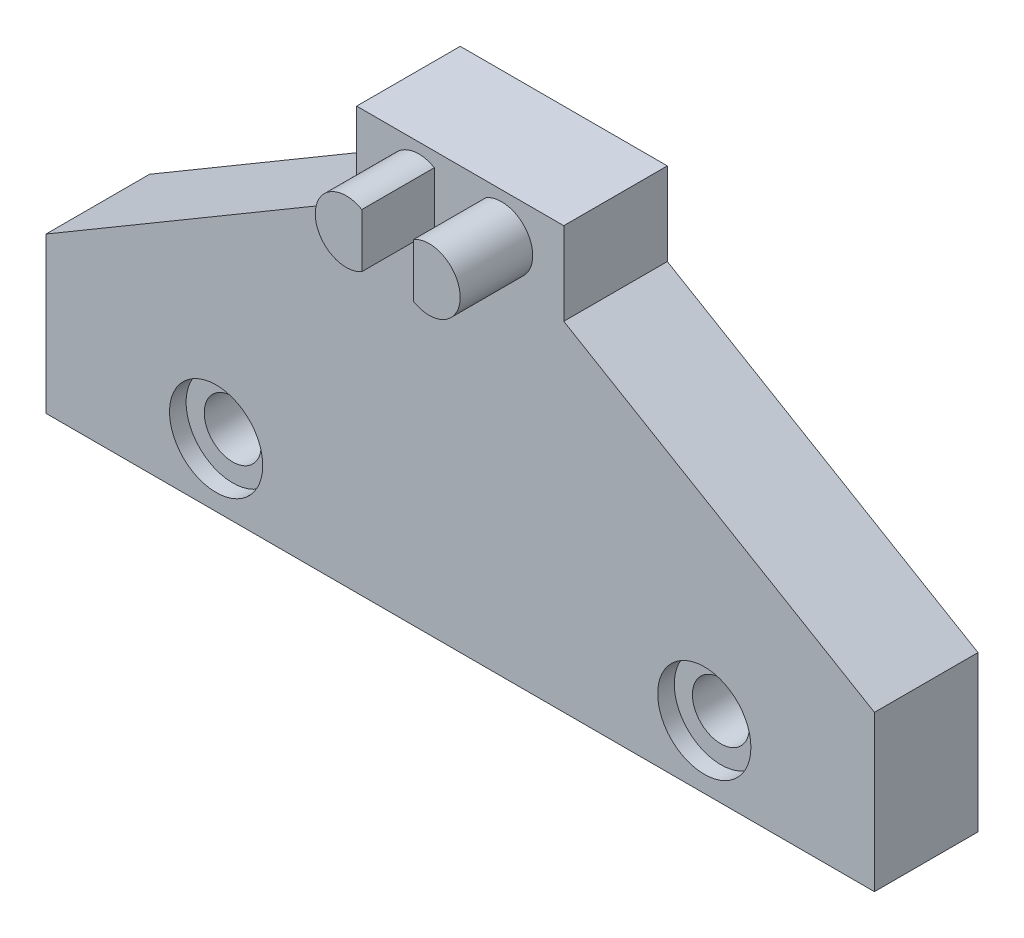
ISO-10303-21;
HEADER;
FILE_DESCRIPTION(('STEP AP214'),'2;1');
FILE_NAME('part.step','',(''),(''),'','','');
FILE_SCHEMA(('AUTOMOTIVE_DESIGN { 1 0 10303 214 1 1 1 1 }'));
ENDSEC;
DATA;
#1=APPLICATION_CONTEXT('core data for automotive mechanical design processes');
#2=APPLICATION_PROTOCOL_DEFINITION('international standard','automotive_design',2000,#1);
#3=PRODUCT_CONTEXT('',#1,'mechanical');
#4=PRODUCT('Part','Part','',(#3));
#5=PRODUCT_RELATED_PRODUCT_CATEGORY('part','',(#4));
#6=PRODUCT_DEFINITION_FORMATION('','',#4);
#7=PRODUCT_DEFINITION_CONTEXT('part definition',#1,'design');
#8=PRODUCT_DEFINITION('design','',#6,#7);
#9=PRODUCT_DEFINITION_SHAPE('','',#8);
#10=(LENGTH_UNIT() NAMED_UNIT(*) SI_UNIT(.MILLI.,.METRE.));
#11=(NAMED_UNIT(*) PLANE_ANGLE_UNIT() SI_UNIT($,.RADIAN.));
#12=(NAMED_UNIT(*) SI_UNIT($,.STERADIAN.) SOLID_ANGLE_UNIT());
#13=UNCERTAINTY_MEASURE_WITH_UNIT(LENGTH_MEASURE(1.E-05),#10,'distance_accuracy_value','');
#14=(GEOMETRIC_REPRESENTATION_CONTEXT(3) GLOBAL_UNCERTAINTY_ASSIGNED_CONTEXT((#13)) GLOBAL_UNIT_ASSIGNED_CONTEXT((#10,
#11,#12)) REPRESENTATION_CONTEXT('',''));
#15=CARTESIAN_POINT('',(0.,0.,0.));
#16=DIRECTION('',(0.,0.,1.));
#17=DIRECTION('',(1.,0.,0.));
#18=AXIS2_PLACEMENT_3D('',#15,#16,#17);
#19=CARTESIAN_POINT('',(-37.9521921783989,-3.95994805770938,0.));
#20=DIRECTION('',(0.,0.,1.));
#21=DIRECTION('',(1.,0.,0.));
#22=AXIS2_PLACEMENT_3D('',#19,#20,#21);
#23=CYLINDRICAL_SURFACE('',#22,2.74999999999999);
#24=CARTESIAN_POINT('',(-37.9521921783989,-3.95994805770938,0.));
#25=DIRECTION('',(0.,0.,1.));
#26=DIRECTION('',(1.,0.,0.));
#27=AXIS2_PLACEMENT_3D('',#24,#25,#26);
#28=CIRCLE('',#27,2.74999999999999);
#29=CARTESIAN_POINT('',(-35.2021921783989,-3.95994805770938,0.));
#30=VERTEX_POINT('',#29);
#31=EDGE_CURVE('E136',#30,#30,#28,.T.);
#32=ORIENTED_EDGE('',*,*,#31,.F.);
#33=EDGE_LOOP('',(#32));
#34=FACE_BOUND('',#33,.T.);
#35=CARTESIAN_POINT('',(-37.9521921783989,-3.95994805770938,8.4));
#36=DIRECTION('',(0.,0.,1.));
#37=DIRECTION('',(1.,0.,0.));
#38=AXIS2_PLACEMENT_3D('',#35,#36,#37);
#39=CIRCLE('',#38,2.74999999999999);
#40=CARTESIAN_POINT('',(-35.2021921783989,-3.95994805770938,8.4));
#41=VERTEX_POINT('',#40);
#42=EDGE_CURVE('E38',#41,#41,#39,.F.);
#43=ORIENTED_EDGE('',*,*,#42,.F.);
#44=EDGE_LOOP('',(#43));
#45=FACE_BOUND('',#44,.T.);
#46=ADVANCED_FACE('F34',(#34,#45),#23,.F.);
#47=CARTESIAN_POINT('',(9.18780782160107,-3.95994805770938,0.));
#48=DIRECTION('',(0.,0.,1.));
#49=DIRECTION('',(1.,0.,0.));
#50=AXIS2_PLACEMENT_3D('',#47,#48,#49);
#51=CYLINDRICAL_SURFACE('',#50,2.74999999999999);
#52=CARTESIAN_POINT('',(9.18780782160107,-3.95994805770938,0.));
#53=DIRECTION('',(0.,0.,-1.));
#54=DIRECTION('',(-1.,0.,0.));
#55=AXIS2_PLACEMENT_3D('',#52,#53,#54);
#56=CIRCLE('',#55,2.74999999999999);
#57=CARTESIAN_POINT('',(6.43780782160108,-3.95994805770938,0.));
#58=VERTEX_POINT('',#57);
#59=EDGE_CURVE('E142',#58,#58,#56,.T.);
#60=ORIENTED_EDGE('',*,*,#59,.T.);
#61=EDGE_LOOP('',(#60));
#62=FACE_BOUND('',#61,.T.);
#63=CARTESIAN_POINT('',(9.18780782160107,-3.95994805770938,8.4));
#64=DIRECTION('',(0.,0.,1.));
#65=DIRECTION('',(1.,0.,0.));
#66=AXIS2_PLACEMENT_3D('',#63,#64,#65);
#67=CIRCLE('',#66,2.74999999999999);
#68=CARTESIAN_POINT('',(11.9378078216011,-3.95994805770938,8.4));
#69=VERTEX_POINT('',#68);
#70=EDGE_CURVE('E206',#69,#69,#67,.T.);
#71=ORIENTED_EDGE('',*,*,#70,.T.);
#72=EDGE_LOOP('',(#71));
#73=FACE_BOUND('',#72,.T.);
#74=ADVANCED_FACE('F239',(#62,#73),#51,.F.);
#75=CARTESIAN_POINT('',(-18.3821921783989,26.6400519422906,17.));
#76=DIRECTION('',(0.,0.,-1.));
#77=DIRECTION('',(-1.,0.,0.));
#78=AXIS2_PLACEMENT_3D('',#75,#76,#77);
#79=CYLINDRICAL_SURFACE('',#78,3.);
#80=DIRECTION('',(0.,0.,-1.));
#81=VECTOR('',#80,1.);
#82=CARTESIAN_POINT('',(-16.8821921783989,24.0419757309373,17.));
#83=LINE('',#82,#81);
#84=CARTESIAN_POINT('',(-16.8821921783989,24.0419757309373,17.));
#85=VERTEX_POINT('',#84);
#86=CARTESIAN_POINT('',(-16.8821921783989,24.0419757309373,10.));
#87=VERTEX_POINT('',#86);
#88=EDGE_CURVE('E235',#85,#87,#83,.T.);
#89=ORIENTED_EDGE('',*,*,#88,.F.);
#90=CARTESIAN_POINT('',(-18.3821921783989,26.6400519422906,17.));
#91=DIRECTION('',(0.,0.,1.));
#92=DIRECTION('',(1.,0.,0.));
#93=AXIS2_PLACEMENT_3D('',#90,#91,#92);
#94=CIRCLE('',#93,3.);
#95=CARTESIAN_POINT('',(-16.8821921783989,29.2381281536439,17.));
#96=VERTEX_POINT('',#95);
#97=EDGE_CURVE('E139',#96,#85,#94,.T.);
#98=ORIENTED_EDGE('',*,*,#97,.F.);
#99=DIRECTION('',(0.,0.,-1.));
#100=VECTOR('',#99,1.);
#101=CARTESIAN_POINT('',(-16.8821921783989,29.2381281536439,17.));
#102=LINE('',#101,#100);
#103=CARTESIAN_POINT('',(-16.8821921783989,29.2381281536439,10.));
#104=VERTEX_POINT('',#103);
#105=EDGE_CURVE('E51',#104,#96,#102,.F.);
#106=ORIENTED_EDGE('',*,*,#105,.F.);
#107=CARTESIAN_POINT('',(-18.3821921783989,26.6400519422906,10.));
#108=DIRECTION('',(0.,0.,1.));
#109=DIRECTION('',(1.,0.,0.));
#110=AXIS2_PLACEMENT_3D('',#107,#108,#109);
#111=CIRCLE('',#110,3.);
#112=EDGE_CURVE('E135',#104,#87,#111,.T.);
#113=ORIENTED_EDGE('',*,*,#112,.T.);
#114=EDGE_LOOP('',(#89,#98,#106,#113));
#115=FACE_BOUND('',#114,.T.);
#116=ADVANCED_FACE('F302',(#115),#79,.T.);
#117=CARTESIAN_POINT('',(-18.3821921783989,26.6400519422906,17.));
#118=DIRECTION('',(0.,0.,1.));
#119=DIRECTION('',(1.,0.,0.));
#120=AXIS2_PLACEMENT_3D('',#117,#118,#119);
#121=PLANE('',#120);
#122=ORIENTED_EDGE('',*,*,#97,.T.);
#123=DIRECTION('',(0.,-1.,0.));
#124=VECTOR('',#123,1.);
#125=CARTESIAN_POINT('',(-16.8821921783989,-10.0599480577094,17.));
#126=LINE('',#125,#124);
#127=EDGE_CURVE('E229',#96,#85,#126,.T.);
#128=ORIENTED_EDGE('',*,*,#127,.F.);
#129=EDGE_LOOP('',(#122,#128));
#130=FACE_BOUND('',#129,.T.);
#131=ADVANCED_FACE('F311',(#130),#121,.T.);
#132=CARTESIAN_POINT('',(-10.3821921783989,26.6400519422906,17.));
#133=DIRECTION('',(0.,0.,-1.));
#134=DIRECTION('',(-1.,0.,0.));
#135=AXIS2_PLACEMENT_3D('',#132,#133,#134);
#136=CYLINDRICAL_SURFACE('',#135,3.);
#137=CARTESIAN_POINT('',(-10.3821921783989,26.6400519422906,10.));
#138=DIRECTION('',(0.,0.,1.));
#139=DIRECTION('',(1.,0.,0.));
#140=AXIS2_PLACEMENT_3D('',#137,#138,#139);
#141=CIRCLE('',#140,3.);
#142=CARTESIAN_POINT('',(-11.8821921783989,24.0419757309373,10.));
#143=VERTEX_POINT('',#142);
#144=CARTESIAN_POINT('',(-11.8821921783989,29.2381281536439,10.));
#145=VERTEX_POINT('',#144);
#146=EDGE_CURVE('E43',#143,#145,#141,.T.);
#147=ORIENTED_EDGE('',*,*,#146,.T.);
#148=DIRECTION('',(0.,0.,-1.));
#149=VECTOR('',#148,1.);
#150=CARTESIAN_POINT('',(-11.8821921783989,29.2381281536439,17.));
#151=LINE('',#150,#149);
#152=CARTESIAN_POINT('',(-11.8821921783989,29.2381281536439,17.));
#153=VERTEX_POINT('',#152);
#154=EDGE_CURVE('E123',#145,#153,#151,.F.);
#155=ORIENTED_EDGE('',*,*,#154,.T.);
#156=CARTESIAN_POINT('',(-10.3821921783989,26.6400519422906,17.));
#157=DIRECTION('',(0.,0.,-1.));
#158=DIRECTION('',(-1.,0.,0.));
#159=AXIS2_PLACEMENT_3D('',#156,#157,#158);
#160=CIRCLE('',#159,3.);
#161=CARTESIAN_POINT('',(-11.8821921783989,24.0419757309373,17.));
#162=VERTEX_POINT('',#161);
#163=EDGE_CURVE('E131',#153,#162,#160,.T.);
#164=ORIENTED_EDGE('',*,*,#163,.T.);
#165=DIRECTION('',(0.,0.,-1.));
#166=VECTOR('',#165,1.);
#167=CARTESIAN_POINT('',(-11.8821921783989,24.0419757309373,17.));
#168=LINE('',#167,#166);
#169=EDGE_CURVE('E59',#162,#143,#168,.T.);
#170=ORIENTED_EDGE('',*,*,#169,.T.);
#171=EDGE_LOOP('',(#147,#155,#164,#170));
#172=FACE_BOUND('',#171,.T.);
#173=ADVANCED_FACE('F130',(#172),#136,.T.);
#174=CARTESIAN_POINT('',(-10.3821921783989,26.6400519422906,17.));
#175=DIRECTION('',(0.,0.,1.));
#176=DIRECTION('',(-1.,0.,0.));
#177=AXIS2_PLACEMENT_3D('',#174,#175,#176);
#178=PLANE('',#177);
#179=ORIENTED_EDGE('',*,*,#163,.F.);
#180=DIRECTION('',(0.,-1.,0.));
#181=VECTOR('',#180,1.);
#182=CARTESIAN_POINT('',(-11.8821921783989,26.6400519422906,17.));
#183=LINE('',#182,#181);
#184=EDGE_CURVE('E11',#153,#162,#183,.T.);
#185=ORIENTED_EDGE('',*,*,#184,.T.);
#186=EDGE_LOOP('',(#179,#185));
#187=FACE_BOUND('',#186,.T.);
#188=ADVANCED_FACE('F134',(#187),#178,.T.);
#189=CARTESIAN_POINT('',(-54.3821921783989,4.94005194229062,10.));
#190=DIRECTION('',(1.,0.,0.));
#191=DIRECTION('',(0.,0.,-1.));
#192=AXIS2_PLACEMENT_3D('',#189,#190,#191);
#193=PLANE('',#192);
#194=DIRECTION('',(0.,-1.,0.));
#195=VECTOR('',#194,1.);
#196=CARTESIAN_POINT('',(-54.3821921783989,4.94005194229062,0.));
#197=LINE('',#196,#195);
#198=CARTESIAN_POINT('',(-54.3821921783989,4.94005194229062,0.));
#199=VERTEX_POINT('',#198);
#200=CARTESIAN_POINT('',(-54.3821921783989,-10.0599480577094,0.));
#201=VERTEX_POINT('',#200);
#202=EDGE_CURVE('E147',#199,#201,#197,.T.);
#203=ORIENTED_EDGE('',*,*,#202,.T.);
#204=DIRECTION('',(0.,0.,-1.));
#205=VECTOR('',#204,1.);
#206=CARTESIAN_POINT('',(-54.3821921783989,-10.0599480577094,10.));
#207=LINE('',#206,#205);
#208=CARTESIAN_POINT('',(-54.3821921783989,-10.0599480577094,10.));
#209=VERTEX_POINT('',#208);
#210=EDGE_CURVE('E203',#209,#201,#207,.T.);
#211=ORIENTED_EDGE('',*,*,#210,.F.);
#212=DIRECTION('',(0.,-1.,0.));
#213=VECTOR('',#212,1.);
#214=CARTESIAN_POINT('',(-54.3821921783989,4.94005194229062,10.));
#215=LINE('',#214,#213);
#216=CARTESIAN_POINT('',(-54.3821921783989,4.94005194229062,10.));
#217=VERTEX_POINT('',#216);
#218=EDGE_CURVE('E149',#217,#209,#215,.T.);
#219=ORIENTED_EDGE('',*,*,#218,.F.);
#220=DIRECTION('',(0.,0.,-1.));
#221=VECTOR('',#220,1.);
#222=CARTESIAN_POINT('',(-54.3821921783989,4.94005194229062,10.));
#223=LINE('',#222,#221);
#224=EDGE_CURVE('E167',#217,#199,#223,.T.);
#225=ORIENTED_EDGE('',*,*,#224,.T.);
#226=EDGE_LOOP('',(#203,#211,#219,#225));
#227=FACE_BOUND('',#226,.T.);
#228=ADVANCED_FACE('F36',(#227),#193,.F.);
#229=CARTESIAN_POINT('',(-54.3821921783989,-10.0599480577094,10.));
#230=DIRECTION('',(0.,1.,0.));
#231=DIRECTION('',(-1.,0.,0.));
#232=AXIS2_PLACEMENT_3D('',#229,#230,#231);
#233=PLANE('',#232);
#234=DIRECTION('',(1.,0.,0.));
#235=VECTOR('',#234,1.);
#236=CARTESIAN_POINT('',(-54.3821921783989,-10.0599480577094,0.));
#237=LINE('',#236,#235);
#238=CARTESIAN_POINT('',(25.6178078216011,-10.0599480577094,0.));
#239=VERTEX_POINT('',#238);
#240=EDGE_CURVE('E170',#201,#239,#237,.T.);
#241=ORIENTED_EDGE('',*,*,#240,.T.);
#242=DIRECTION('',(0.,0.,-1.));
#243=VECTOR('',#242,1.);
#244=CARTESIAN_POINT('',(25.6178078216011,-10.0599480577094,10.));
#245=LINE('',#244,#243);
#246=CARTESIAN_POINT('',(25.6178078216011,-10.0599480577094,10.));
#247=VERTEX_POINT('',#246);
#248=EDGE_CURVE('E200',#247,#239,#245,.T.);
#249=ORIENTED_EDGE('',*,*,#248,.F.);
#250=DIRECTION('',(1.,0.,0.));
#251=VECTOR('',#250,1.);
#252=CARTESIAN_POINT('',(-54.3821921783989,-10.0599480577094,10.));
#253=LINE('',#252,#251);
#254=EDGE_CURVE('E152',#209,#247,#253,.T.);
#255=ORIENTED_EDGE('',*,*,#254,.F.);
#256=ORIENTED_EDGE('',*,*,#210,.T.);
#257=EDGE_LOOP('',(#241,#249,#255,#256));
#258=FACE_BOUND('',#257,.T.);
#259=ADVANCED_FACE('F284',(#258),#233,.F.);
#260=CARTESIAN_POINT('',(25.6178078216011,4.94005194229062,10.));
#261=DIRECTION('',(-1.,0.,0.));
#262=DIRECTION('',(0.,0.,1.));
#263=AXIS2_PLACEMENT_3D('',#260,#261,#262);
#264=PLANE('',#263);
#265=DIRECTION('',(0.,1.,0.));
#266=VECTOR('',#265,1.);
#267=CARTESIAN_POINT('',(25.6178078216011,4.94005194229062,0.));
#268=LINE('',#267,#266);
#269=CARTESIAN_POINT('',(25.6178078216011,4.94005194229062,0.));
#270=VERTEX_POINT('',#269);
#271=EDGE_CURVE('E172',#239,#270,#268,.T.);
#272=ORIENTED_EDGE('',*,*,#271,.T.);
#273=DIRECTION('',(0.,0.,-1.));
#274=VECTOR('',#273,1.);
#275=CARTESIAN_POINT('',(25.6178078216011,4.94005194229062,10.));
#276=LINE('',#275,#274);
#277=CARTESIAN_POINT('',(25.6178078216011,4.94005194229062,10.));
#278=VERTEX_POINT('',#277);
#279=EDGE_CURVE('E197',#278,#270,#276,.T.);
#280=ORIENTED_EDGE('',*,*,#279,.F.);
#281=DIRECTION('',(0.,1.,0.));
#282=VECTOR('',#281,1.);
#283=CARTESIAN_POINT('',(25.6178078216011,4.94005194229062,10.));
#284=LINE('',#283,#282);
#285=EDGE_CURVE('E155',#247,#278,#284,.T.);
#286=ORIENTED_EDGE('',*,*,#285,.F.);
#287=ORIENTED_EDGE('',*,*,#248,.T.);
#288=EDGE_LOOP('',(#272,#280,#286,#287));
#289=FACE_BOUND('',#288,.T.);
#290=ADVANCED_FACE('F280',(#289),#264,.F.);
#291=CARTESIAN_POINT('',(-4.38219217839893,22.6400519422906,10.));
#292=DIRECTION('',(-0.508148861978286,-0.861269257590315,0.));
#293=DIRECTION('',(0.861269257590315,-0.508148861978286,0.));
#294=AXIS2_PLACEMENT_3D('',#291,#292,#293);
#295=PLANE('',#294);
#296=DIRECTION('',(-0.861269257590315,0.508148861978286,0.));
#297=VECTOR('',#296,1.);
#298=CARTESIAN_POINT('',(-4.38219217839893,22.6400519422906,0.));
#299=LINE('',#298,#297);
#300=CARTESIAN_POINT('',(-4.38219217839893,22.6400519422906,0.));
#301=VERTEX_POINT('',#300);
#302=EDGE_CURVE('E174',#270,#301,#299,.T.);
#303=ORIENTED_EDGE('',*,*,#302,.T.);
#304=DIRECTION('',(0.,0.,-1.));
#305=VECTOR('',#304,1.);
#306=CARTESIAN_POINT('',(-4.38219217839893,22.6400519422906,10.));
#307=LINE('',#306,#305);
#308=CARTESIAN_POINT('',(-4.38219217839893,22.6400519422906,10.));
#309=VERTEX_POINT('',#308);
#310=EDGE_CURVE('E194',#309,#301,#307,.T.);
#311=ORIENTED_EDGE('',*,*,#310,.F.);
#312=DIRECTION('',(-0.861269257590315,0.508148861978286,0.));
#313=VECTOR('',#312,1.);
#314=CARTESIAN_POINT('',(-4.38219217839893,22.6400519422906,10.));
#315=LINE('',#314,#313);
#316=EDGE_CURVE('E157',#278,#309,#315,.T.);
#317=ORIENTED_EDGE('',*,*,#316,.F.);
#318=ORIENTED_EDGE('',*,*,#279,.T.);
#319=EDGE_LOOP('',(#303,#311,#317,#318));
#320=FACE_BOUND('',#319,.T.);
#321=ADVANCED_FACE('F277',(#320),#295,.F.);
#322=CARTESIAN_POINT('',(-4.38219217839893,30.6400519422906,10.));
#323=DIRECTION('',(-1.,0.,0.));
#324=DIRECTION('',(0.,0.,1.));
#325=AXIS2_PLACEMENT_3D('',#322,#323,#324);
#326=PLANE('',#325);
#327=DIRECTION('',(0.,1.,0.));
#328=VECTOR('',#327,1.);
#329=CARTESIAN_POINT('',(-4.38219217839893,30.6400519422906,0.));
#330=LINE('',#329,#328);
#331=CARTESIAN_POINT('',(-4.38219217839893,30.6400519422906,0.));
#332=VERTEX_POINT('',#331);
#333=EDGE_CURVE('E176',#301,#332,#330,.T.);
#334=ORIENTED_EDGE('',*,*,#333,.T.);
#335=DIRECTION('',(0.,0.,-1.));
#336=VECTOR('',#335,1.);
#337=CARTESIAN_POINT('',(-4.38219217839893,30.6400519422906,10.));
#338=LINE('',#337,#336);
#339=CARTESIAN_POINT('',(-4.38219217839893,30.6400519422906,10.));
#340=VERTEX_POINT('',#339);
#341=EDGE_CURVE('E191',#340,#332,#338,.T.);
#342=ORIENTED_EDGE('',*,*,#341,.F.);
#343=DIRECTION('',(0.,1.,0.));
#344=VECTOR('',#343,1.);
#345=CARTESIAN_POINT('',(-4.38219217839893,30.6400519422906,10.));
#346=LINE('',#345,#344);
#347=EDGE_CURVE('E159',#309,#340,#346,.T.);
#348=ORIENTED_EDGE('',*,*,#347,.F.);
#349=ORIENTED_EDGE('',*,*,#310,.T.);
#350=EDGE_LOOP('',(#334,#342,#348,#349));
#351=FACE_BOUND('',#350,.T.);
#352=ADVANCED_FACE('F273',(#351),#326,.F.);
#353=CARTESIAN_POINT('',(-24.3821921783989,30.6400519422906,10.));
#354=DIRECTION('',(0.,-1.,0.));
#355=DIRECTION('',(0.,0.,-1.));
#356=AXIS2_PLACEMENT_3D('',#353,#354,#355);
#357=PLANE('',#356);
#358=DIRECTION('',(-1.,0.,0.));
#359=VECTOR('',#358,1.);
#360=CARTESIAN_POINT('',(-24.3821921783989,30.6400519422906,0.));
#361=LINE('',#360,#359);
#362=CARTESIAN_POINT('',(-24.3821921783989,30.6400519422906,0.));
#363=VERTEX_POINT('',#362);
#364=EDGE_CURVE('E178',#332,#363,#361,.T.);
#365=ORIENTED_EDGE('',*,*,#364,.T.);
#366=DIRECTION('',(0.,0.,-1.));
#367=VECTOR('',#366,1.);
#368=CARTESIAN_POINT('',(-24.3821921783989,30.6400519422906,10.));
#369=LINE('',#368,#367);
#370=CARTESIAN_POINT('',(-24.3821921783989,30.6400519422906,10.));
#371=VERTEX_POINT('',#370);
#372=EDGE_CURVE('E188',#371,#363,#369,.T.);
#373=ORIENTED_EDGE('',*,*,#372,.F.);
#374=DIRECTION('',(-1.,0.,0.));
#375=VECTOR('',#374,1.);
#376=CARTESIAN_POINT('',(-24.3821921783989,30.6400519422906,10.));
#377=LINE('',#376,#375);
#378=EDGE_CURVE('E161',#340,#371,#377,.T.);
#379=ORIENTED_EDGE('',*,*,#378,.F.);
#380=ORIENTED_EDGE('',*,*,#341,.T.);
#381=EDGE_LOOP('',(#365,#373,#379,#380));
#382=FACE_BOUND('',#381,.T.);
#383=ADVANCED_FACE('F268',(#382),#357,.F.);
#384=CARTESIAN_POINT('',(-24.3821921783989,30.6400519422906,10.));
#385=DIRECTION('',(1.,0.,0.));
#386=DIRECTION('',(0.,0.,-1.));
#387=AXIS2_PLACEMENT_3D('',#384,#385,#386);
#388=PLANE('',#387);
#389=DIRECTION('',(0.,-1.,0.));
#390=VECTOR('',#389,1.);
#391=CARTESIAN_POINT('',(-24.3821921783989,30.6400519422906,0.));
#392=LINE('',#391,#390);
#393=CARTESIAN_POINT('',(-24.3821921783989,22.6400519422906,0.));
#394=VERTEX_POINT('',#393);
#395=EDGE_CURVE('E180',#363,#394,#392,.T.);
#396=ORIENTED_EDGE('',*,*,#395,.T.);
#397=DIRECTION('',(0.,0.,-1.));
#398=VECTOR('',#397,1.);
#399=CARTESIAN_POINT('',(-24.3821921783989,22.6400519422906,10.));
#400=LINE('',#399,#398);
#401=CARTESIAN_POINT('',(-24.3821921783989,22.6400519422906,10.));
#402=VERTEX_POINT('',#401);
#403=EDGE_CURVE('E185',#402,#394,#400,.T.);
#404=ORIENTED_EDGE('',*,*,#403,.F.);
#405=DIRECTION('',(0.,-1.,0.));
#406=VECTOR('',#405,1.);
#407=CARTESIAN_POINT('',(-24.3821921783989,30.6400519422906,10.));
#408=LINE('',#407,#406);
#409=EDGE_CURVE('E163',#371,#402,#408,.T.);
#410=ORIENTED_EDGE('',*,*,#409,.F.);
#411=ORIENTED_EDGE('',*,*,#372,.T.);
#412=EDGE_LOOP('',(#396,#404,#410,#411));
#413=FACE_BOUND('',#412,.T.);
#414=ADVANCED_FACE('F262',(#413),#388,.F.);
#415=CARTESIAN_POINT('',(-24.3821921783989,22.6400519422906,10.));
#416=DIRECTION('',(0.508148861978286,-0.861269257590315,0.));
#417=DIRECTION('',(0.861269257590315,0.508148861978286,0.));
#418=AXIS2_PLACEMENT_3D('',#415,#416,#417);
#419=PLANE('',#418);
#420=DIRECTION('',(-0.861269257590315,-0.508148861978286,0.));
#421=VECTOR('',#420,1.);
#422=CARTESIAN_POINT('',(-24.3821921783989,22.6400519422906,0.));
#423=LINE('',#422,#421);
#424=EDGE_CURVE('E153',#394,#199,#423,.T.);
#425=ORIENTED_EDGE('',*,*,#424,.T.);
#426=ORIENTED_EDGE('',*,*,#224,.F.);
#427=DIRECTION('',(-0.861269257590315,-0.508148861978286,0.));
#428=VECTOR('',#427,1.);
#429=CARTESIAN_POINT('',(-24.3821921783989,22.6400519422906,10.));
#430=LINE('',#429,#428);
#431=EDGE_CURVE('E165',#402,#217,#430,.T.);
#432=ORIENTED_EDGE('',*,*,#431,.F.);
#433=ORIENTED_EDGE('',*,*,#403,.T.);
#434=EDGE_LOOP('',(#425,#426,#432,#433));
#435=FACE_BOUND('',#434,.T.);
#436=ADVANCED_FACE('F258',(#435),#419,.F.);
#437=CARTESIAN_POINT('',(0.,0.,10.));
#438=DIRECTION('',(0.,0.,1.));
#439=DIRECTION('',(1.,0.,0.));
#440=AXIS2_PLACEMENT_3D('',#437,#438,#439);
#441=PLANE('',#440);
#442=CARTESIAN_POINT('',(-37.9521921783989,-3.95994805770938,10.));
#443=DIRECTION('',(0.,0.,1.));
#444=DIRECTION('',(1.,0.,0.));
#445=AXIS2_PLACEMENT_3D('',#442,#443,#444);
#446=CIRCLE('',#445,4.5);
#447=CARTESIAN_POINT('',(-33.4521921783989,-3.95994805770938,10.));
#448=VERTEX_POINT('',#447);
#449=EDGE_CURVE('E214',#448,#448,#446,.T.);
#450=ORIENTED_EDGE('',*,*,#449,.F.);
#451=EDGE_LOOP('',(#450));
#452=FACE_BOUND('',#451,.T.);
#453=CARTESIAN_POINT('',(9.18780782160107,-3.95994805770938,10.));
#454=DIRECTION('',(0.,0.,1.));
#455=DIRECTION('',(1.,0.,0.));
#456=AXIS2_PLACEMENT_3D('',#453,#454,#455);
#457=CIRCLE('',#456,4.5);
#458=CARTESIAN_POINT('',(13.6878078216011,-3.95994805770938,10.));
#459=VERTEX_POINT('',#458);
#460=EDGE_CURVE('E224',#459,#459,#457,.T.);
#461=ORIENTED_EDGE('',*,*,#460,.F.);
#462=EDGE_LOOP('',(#461));
#463=FACE_BOUND('',#462,.T.);
#464=DIRECTION('',(0.,-1.,0.));
#465=VECTOR('',#464,1.);
#466=CARTESIAN_POINT('',(-16.8821921783989,-10.0599480577094,10.));
#467=LINE('',#466,#465);
#468=EDGE_CURVE('E212',#104,#87,#467,.T.);
#469=ORIENTED_EDGE('',*,*,#468,.T.);
#470=ORIENTED_EDGE('',*,*,#112,.F.);
#471=EDGE_LOOP('',(#469,#470));
#472=FACE_BOUND('',#471,.T.);
#473=DIRECTION('',(0.,1.,0.));
#474=VECTOR('',#473,1.);
#475=CARTESIAN_POINT('',(-11.8821921783989,-10.0599480577094,10.));
#476=LINE('',#475,#474);
#477=EDGE_CURVE('E227',#143,#145,#476,.T.);
#478=ORIENTED_EDGE('',*,*,#477,.T.);
#479=ORIENTED_EDGE('',*,*,#146,.F.);
#480=EDGE_LOOP('',(#478,#479));
#481=FACE_BOUND('',#480,.T.);
#482=ORIENTED_EDGE('',*,*,#254,.T.);
#483=ORIENTED_EDGE('',*,*,#285,.T.);
#484=ORIENTED_EDGE('',*,*,#316,.T.);
#485=ORIENTED_EDGE('',*,*,#347,.T.);
#486=ORIENTED_EDGE('',*,*,#378,.T.);
#487=ORIENTED_EDGE('',*,*,#409,.T.);
#488=ORIENTED_EDGE('',*,*,#431,.T.);
#489=ORIENTED_EDGE('',*,*,#218,.T.);
#490=EDGE_LOOP('',(#482,#483,#484,#485,#486,#487,#488,#489));
#491=FACE_BOUND('',#490,.T.);
#492=ADVANCED_FACE('F244',(#452,#463,#472,#481,#491),#441,.T.);
#493=CARTESIAN_POINT('',(0.,0.,0.));
#494=DIRECTION('',(0.,0.,1.));
#495=DIRECTION('',(1.,0.,0.));
#496=AXIS2_PLACEMENT_3D('',#493,#494,#495);
#497=PLANE('',#496);
#498=ORIENTED_EDGE('',*,*,#59,.F.);
#499=EDGE_LOOP('',(#498));
#500=FACE_BOUND('',#499,.T.);
#501=ORIENTED_EDGE('',*,*,#31,.T.);
#502=EDGE_LOOP('',(#501));
#503=FACE_BOUND('',#502,.T.);
#504=ORIENTED_EDGE('',*,*,#202,.F.);
#505=ORIENTED_EDGE('',*,*,#424,.F.);
#506=ORIENTED_EDGE('',*,*,#395,.F.);
#507=ORIENTED_EDGE('',*,*,#364,.F.);
#508=ORIENTED_EDGE('',*,*,#333,.F.);
#509=ORIENTED_EDGE('',*,*,#302,.F.);
#510=ORIENTED_EDGE('',*,*,#271,.F.);
#511=ORIENTED_EDGE('',*,*,#240,.F.);
#512=EDGE_LOOP('',(#504,#505,#506,#507,#508,#509,#510,#511));
#513=FACE_BOUND('',#512,.T.);
#514=ADVANCED_FACE('F241',(#500,#503,#513),#497,.F.);
#515=CARTESIAN_POINT('',(-11.8821921783989,-10.0599480577094,58.0059751743572));
#516=DIRECTION('',(-1.,0.,0.));
#517=DIRECTION('',(0.,0.,1.));
#518=AXIS2_PLACEMENT_3D('',#515,#516,#517);
#519=PLANE('',#518);
#520=ORIENTED_EDGE('',*,*,#477,.F.);
#521=ORIENTED_EDGE('',*,*,#169,.F.);
#522=ORIENTED_EDGE('',*,*,#184,.F.);
#523=ORIENTED_EDGE('',*,*,#154,.F.);
#524=EDGE_LOOP('',(#520,#521,#522,#523));
#525=FACE_BOUND('',#524,.T.);
#526=ADVANCED_FACE('F122',(#525),#519,.T.);
#527=CARTESIAN_POINT('',(-16.8821921783989,-10.0599480577094,58.0059751743572));
#528=DIRECTION('',(1.,0.,0.));
#529=DIRECTION('',(0.,0.,-1.));
#530=AXIS2_PLACEMENT_3D('',#527,#528,#529);
#531=PLANE('',#530);
#532=ORIENTED_EDGE('',*,*,#88,.T.);
#533=ORIENTED_EDGE('',*,*,#468,.F.);
#534=ORIENTED_EDGE('',*,*,#105,.T.);
#535=ORIENTED_EDGE('',*,*,#127,.T.);
#536=EDGE_LOOP('',(#532,#533,#534,#535));
#537=FACE_BOUND('',#536,.T.);
#538=ADVANCED_FACE('F321',(#537),#531,.T.);
#539=CARTESIAN_POINT('',(9.18780782160107,-3.95994805770938,8.4));
#540=DIRECTION('',(0.,0.,1.));
#541=DIRECTION('',(1.,0.,0.));
#542=AXIS2_PLACEMENT_3D('',#539,#540,#541);
#543=CYLINDRICAL_SURFACE('',#542,4.5);
#544=CARTESIAN_POINT('',(9.18780782160107,-3.95994805770938,8.4));
#545=DIRECTION('',(0.,0.,1.));
#546=DIRECTION('',(1.,0.,0.));
#547=AXIS2_PLACEMENT_3D('',#544,#545,#546);
#548=CIRCLE('',#547,4.5);
#549=CARTESIAN_POINT('',(13.6878078216011,-3.95994805770938,8.4));
#550=VERTEX_POINT('',#549);
#551=EDGE_CURVE('E219',#550,#550,#548,.T.);
#552=ORIENTED_EDGE('',*,*,#551,.F.);
#553=EDGE_LOOP('',(#552));
#554=FACE_BOUND('',#553,.T.);
#555=ORIENTED_EDGE('',*,*,#460,.T.);
#556=EDGE_LOOP('',(#555));
#557=FACE_BOUND('',#556,.T.);
#558=ADVANCED_FACE('F323',(#554,#557),#543,.F.);
#559=CARTESIAN_POINT('',(9.18780782160107,-3.95994805770938,8.4));
#560=DIRECTION('',(0.,0.,1.));
#561=DIRECTION('',(1.,0.,0.));
#562=AXIS2_PLACEMENT_3D('',#559,#560,#561);
#563=PLANE('',#562);
#564=ORIENTED_EDGE('',*,*,#70,.F.);
#565=EDGE_LOOP('',(#564));
#566=FACE_BOUND('',#565,.T.);
#567=ORIENTED_EDGE('',*,*,#551,.T.);
#568=EDGE_LOOP('',(#567));
#569=FACE_BOUND('',#568,.T.);
#570=ADVANCED_FACE('F328',(#566,#569),#563,.T.);
#571=CARTESIAN_POINT('',(-37.9521921783989,-3.95994805770938,8.4));
#572=DIRECTION('',(0.,0.,1.));
#573=DIRECTION('',(1.,0.,0.));
#574=AXIS2_PLACEMENT_3D('',#571,#572,#573);
#575=PLANE('',#574);
#576=CARTESIAN_POINT('',(-37.9521921783989,-3.95994805770938,8.4));
#577=DIRECTION('',(0.,0.,1.));
#578=DIRECTION('',(1.,0.,0.));
#579=AXIS2_PLACEMENT_3D('',#576,#577,#578);
#580=CIRCLE('',#579,4.5);
#581=CARTESIAN_POINT('',(-33.4521921783989,-3.95994805770938,8.4));
#582=VERTEX_POINT('',#581);
#583=EDGE_CURVE('E208',#582,#582,#580,.T.);
#584=ORIENTED_EDGE('',*,*,#583,.T.);
#585=EDGE_LOOP('',(#584));
#586=FACE_BOUND('',#585,.T.);
#587=ORIENTED_EDGE('',*,*,#42,.T.);
#588=EDGE_LOOP('',(#587));
#589=FACE_BOUND('',#588,.T.);
#590=ADVANCED_FACE('F335',(#586,#589),#575,.T.);
#591=CARTESIAN_POINT('',(-37.9521921783989,-3.95994805770938,8.4));
#592=DIRECTION('',(0.,0.,1.));
#593=DIRECTION('',(1.,0.,0.));
#594=AXIS2_PLACEMENT_3D('',#591,#592,#593);
#595=CYLINDRICAL_SURFACE('',#594,4.5);
#596=ORIENTED_EDGE('',*,*,#583,.F.);
#597=EDGE_LOOP('',(#596));
#598=FACE_BOUND('',#597,.T.);
#599=ORIENTED_EDGE('',*,*,#449,.T.);
#600=EDGE_LOOP('',(#599));
#601=FACE_BOUND('',#600,.T.);
#602=ADVANCED_FACE('F337',(#598,#601),#595,.F.);
#603=CLOSED_SHELL('',(#46,#74,#116,#131,#173,#188,#228,#259,#290,#321,#352,#383,#414,#436,#492,
#514,#526,#538,#558,#570,#590,#602));
#604=MANIFOLD_SOLID_BREP('B2',#603);
#605=ADVANCED_BREP_SHAPE_REPRESENTATION('',(#18,#604),#14);
#606=SHAPE_DEFINITION_REPRESENTATION(#9,#605);
ENDSEC;
END-ISO-10303-21;
